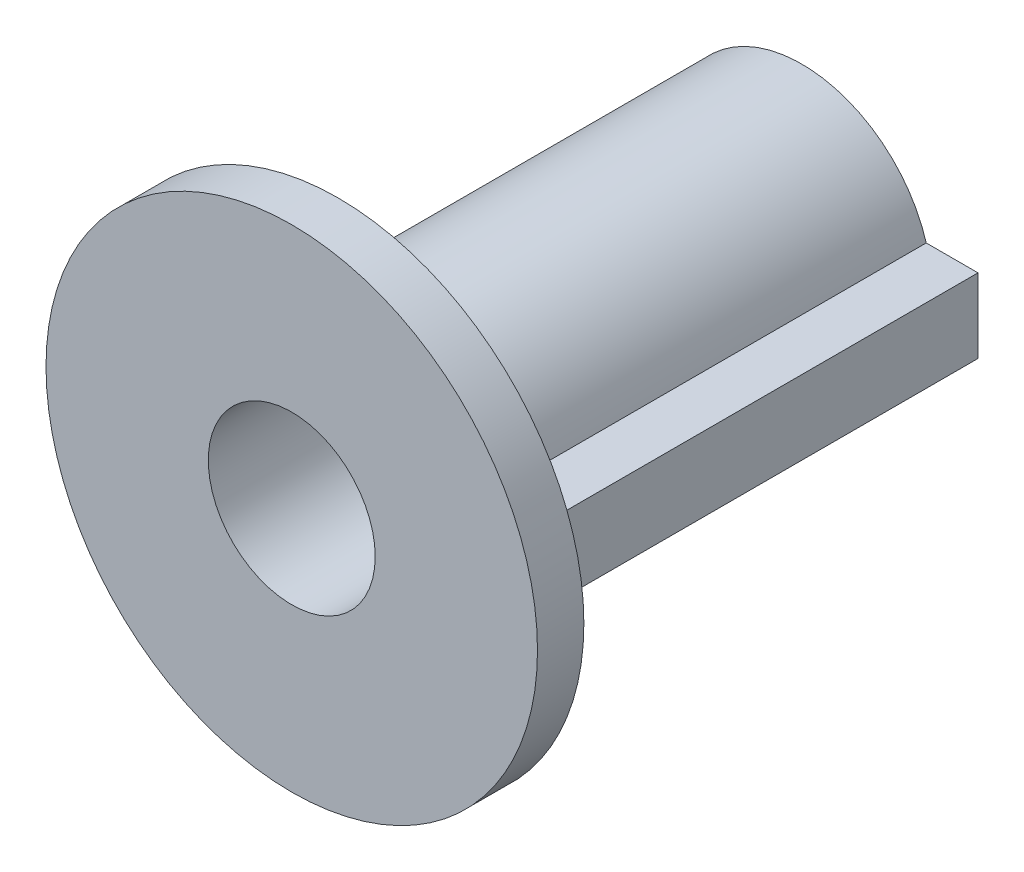
ISO-10303-21;
HEADER;
FILE_DESCRIPTION(('STEP AP214'),'2;1');
FILE_NAME('part.step','',(''),(''),'','','');
FILE_SCHEMA(('AUTOMOTIVE_DESIGN { 1 0 10303 214 1 1 1 1 }'));
ENDSEC;
DATA;
#1=APPLICATION_CONTEXT('core data for automotive mechanical design processes');
#2=APPLICATION_PROTOCOL_DEFINITION('international standard','automotive_design',2000,#1);
#3=PRODUCT_CONTEXT('',#1,'mechanical');
#4=PRODUCT('Part','Part','',(#3));
#5=PRODUCT_RELATED_PRODUCT_CATEGORY('part','',(#4));
#6=PRODUCT_DEFINITION_FORMATION('','',#4);
#7=PRODUCT_DEFINITION_CONTEXT('part definition',#1,'design');
#8=PRODUCT_DEFINITION('design','',#6,#7);
#9=PRODUCT_DEFINITION_SHAPE('','',#8);
#10=(LENGTH_UNIT() NAMED_UNIT(*) SI_UNIT(.MILLI.,.METRE.));
#11=(NAMED_UNIT(*) PLANE_ANGLE_UNIT() SI_UNIT($,.RADIAN.));
#12=(NAMED_UNIT(*) SI_UNIT($,.STERADIAN.) SOLID_ANGLE_UNIT());
#13=UNCERTAINTY_MEASURE_WITH_UNIT(LENGTH_MEASURE(1.E-05),#10,'distance_accuracy_value','');
#14=(GEOMETRIC_REPRESENTATION_CONTEXT(3) GLOBAL_UNCERTAINTY_ASSIGNED_CONTEXT((#13)) GLOBAL_UNIT_ASSIGNED_CONTEXT((#10,
#11,#12)) REPRESENTATION_CONTEXT('',''));
#15=CARTESIAN_POINT('',(0.,0.,0.));
#16=DIRECTION('',(0.,0.,1.));
#17=DIRECTION('',(1.,0.,0.));
#18=AXIS2_PLACEMENT_3D('',#15,#16,#17);
#19=CARTESIAN_POINT('',(-29.2,0.,13.655634003353));
#20=DIRECTION('',(-1.,0.,0.));
#21=DIRECTION('',(0.,0.,1.));
#22=AXIS2_PLACEMENT_3D('',#19,#20,#21);
#23=PLANE('',#22);
#24=DIRECTION('',(0.,0.,-1.));
#25=VECTOR('',#24,1.);
#26=CARTESIAN_POINT('',(-29.2,10.8,13.655634003353));
#27=LINE('',#26,#25);
#28=CARTESIAN_POINT('',(-29.2,10.8,5.));
#29=VERTEX_POINT('',#28);
#30=CARTESIAN_POINT('',(-29.2,10.8,-5.));
#31=VERTEX_POINT('',#30);
#32=EDGE_CURVE('E97',#29,#31,#27,.T.);
#33=ORIENTED_EDGE('',*,*,#32,.F.);
#34=DIRECTION('',(0.,-1.,0.));
#35=VECTOR('',#34,1.);
#36=CARTESIAN_POINT('',(-29.2,0.,5.));
#37=LINE('',#36,#35);
#38=CARTESIAN_POINT('',(-29.2,9.20000000000001,5.));
#39=VERTEX_POINT('',#38);
#40=EDGE_CURVE('E45',#29,#39,#37,.T.);
#41=ORIENTED_EDGE('',*,*,#40,.T.);
#42=DIRECTION('',(0.,0.,-1.));
#43=VECTOR('',#42,1.);
#44=CARTESIAN_POINT('',(-29.2,9.20000000000001,13.655634003353));
#45=LINE('',#44,#43);
#46=CARTESIAN_POINT('',(-29.2,9.20000000000001,-5.));
#47=VERTEX_POINT('',#46);
#48=EDGE_CURVE('E99',#39,#47,#45,.T.);
#49=ORIENTED_EDGE('',*,*,#48,.T.);
#50=DIRECTION('',(0.,-1.,0.));
#51=VECTOR('',#50,1.);
#52=CARTESIAN_POINT('',(-29.2,0.,-5.));
#53=LINE('',#52,#51);
#54=EDGE_CURVE('E112',#31,#47,#53,.T.);
#55=ORIENTED_EDGE('',*,*,#54,.F.);
#56=EDGE_LOOP('',(#33,#41,#49,#55));
#57=FACE_BOUND('',#56,.T.);
#58=ADVANCED_FACE('F41',(#57),#23,.F.);
#59=CARTESIAN_POINT('',(0.,9.20000000000001,13.655634003353));
#60=DIRECTION('',(0.,1.,0.));
#61=DIRECTION('',(0.,0.,1.));
#62=AXIS2_PLACEMENT_3D('',#59,#60,#61);
#63=PLANE('',#62);
#64=ORIENTED_EDGE('',*,*,#48,.F.);
#65=DIRECTION('',(-1.,0.,0.));
#66=VECTOR('',#65,1.);
#67=CARTESIAN_POINT('',(0.,9.20000000000001,5.));
#68=LINE('',#67,#66);
#69=CARTESIAN_POINT('',(-30.3167184270003,9.20000000000001,5.));
#70=VERTEX_POINT('',#69);
#71=EDGE_CURVE('E92',#39,#70,#68,.T.);
#72=ORIENTED_EDGE('',*,*,#71,.T.);
#73=DIRECTION('',(0.,0.,-1.));
#74=VECTOR('',#73,1.);
#75=CARTESIAN_POINT('',(-30.3167184270003,9.20000000000001,13.655634003353));
#76=LINE('',#75,#74);
#77=CARTESIAN_POINT('',(-30.3167184270003,9.20000000000001,-5.));
#78=VERTEX_POINT('',#77);
#79=EDGE_CURVE('E89',#70,#78,#76,.T.);
#80=ORIENTED_EDGE('',*,*,#79,.T.);
#81=DIRECTION('',(-1.,0.,0.));
#82=VECTOR('',#81,1.);
#83=CARTESIAN_POINT('',(0.,9.20000000000001,-5.));
#84=LINE('',#83,#82);
#85=EDGE_CURVE('E107',#47,#78,#84,.T.);
#86=ORIENTED_EDGE('',*,*,#85,.F.);
#87=EDGE_LOOP('',(#64,#72,#80,#86));
#88=FACE_BOUND('',#87,.T.);
#89=ADVANCED_FACE('F106',(#88),#63,.F.);
#90=CARTESIAN_POINT('',(-33.,10.,13.655634003353));
#91=DIRECTION('',(0.,0.,-1.));
#92=DIRECTION('',(-1.,0.,0.));
#93=AXIS2_PLACEMENT_3D('',#90,#91,#92);
#94=CYLINDRICAL_SURFACE('',#93,2.8);
#95=ORIENTED_EDGE('',*,*,#79,.F.);
#96=CARTESIAN_POINT('',(-33.,10.,5.));
#97=DIRECTION('',(0.,0.,-1.));
#98=DIRECTION('',(-1.,0.,0.));
#99=AXIS2_PLACEMENT_3D('',#96,#97,#98);
#100=CIRCLE('',#99,2.8);
#101=CARTESIAN_POINT('',(-30.3167184270003,10.8,5.));
#102=VERTEX_POINT('',#101);
#103=EDGE_CURVE('E50',#70,#102,#100,.T.);
#104=ORIENTED_EDGE('',*,*,#103,.T.);
#105=DIRECTION('',(0.,0.,-1.));
#106=VECTOR('',#105,1.);
#107=CARTESIAN_POINT('',(-30.3167184270003,10.8,13.655634003353));
#108=LINE('',#107,#106);
#109=CARTESIAN_POINT('',(-30.3167184270003,10.8,-5.));
#110=VERTEX_POINT('',#109);
#111=EDGE_CURVE('E65',#102,#110,#108,.T.);
#112=ORIENTED_EDGE('',*,*,#111,.T.);
#113=CARTESIAN_POINT('',(-33.,10.,-5.));
#114=DIRECTION('',(0.,0.,1.));
#115=DIRECTION('',(1.,0.,0.));
#116=AXIS2_PLACEMENT_3D('',#113,#114,#115);
#117=CIRCLE('',#116,2.8);
#118=EDGE_CURVE('E100',#78,#110,#117,.F.);
#119=ORIENTED_EDGE('',*,*,#118,.F.);
#120=EDGE_LOOP('',(#95,#104,#112,#119));
#121=FACE_BOUND('',#120,.T.);
#122=ADVANCED_FACE('F90',(#121),#94,.T.);
#123=CARTESIAN_POINT('',(0.,10.8,13.655634003353));
#124=DIRECTION('',(0.,-1.,0.));
#125=DIRECTION('',(0.,0.,-1.));
#126=AXIS2_PLACEMENT_3D('',#123,#124,#125);
#127=PLANE('',#126);
#128=ORIENTED_EDGE('',*,*,#111,.F.);
#129=DIRECTION('',(1.,0.,0.));
#130=VECTOR('',#129,1.);
#131=CARTESIAN_POINT('',(0.,10.8,5.));
#132=LINE('',#131,#130);
#133=EDGE_CURVE('E11',#102,#29,#132,.T.);
#134=ORIENTED_EDGE('',*,*,#133,.T.);
#135=ORIENTED_EDGE('',*,*,#32,.T.);
#136=DIRECTION('',(1.,0.,0.));
#137=VECTOR('',#136,1.);
#138=CARTESIAN_POINT('',(0.,10.8,-5.));
#139=LINE('',#138,#137);
#140=EDGE_CURVE('E88',#110,#31,#139,.T.);
#141=ORIENTED_EDGE('',*,*,#140,.F.);
#142=EDGE_LOOP('',(#128,#134,#135,#141));
#143=FACE_BOUND('',#142,.T.);
#144=ADVANCED_FACE('F43',(#143),#127,.F.);
#145=CARTESIAN_POINT('',(-33.,10.,-5.));
#146=DIRECTION('',(0.,0.,1.));
#147=DIRECTION('',(0.,-1.,0.));
#148=AXIS2_PLACEMENT_3D('',#145,#146,#147);
#149=PLANE('',#148);
#150=CARTESIAN_POINT('',(-33.,10.,-5.00000000000001));
#151=DIRECTION('',(0.,0.,1.));
#152=DIRECTION('',(1.,0.,0.));
#153=AXIS2_PLACEMENT_3D('',#150,#151,#152);
#154=CIRCLE('',#153,1.8);
#155=CARTESIAN_POINT('',(-31.2,10.,-5.00000000000001));
#156=VERTEX_POINT('',#155);
#157=EDGE_CURVE('E124',#156,#156,#154,.T.);
#158=ORIENTED_EDGE('',*,*,#157,.T.);
#159=EDGE_LOOP('',(#158));
#160=FACE_BOUND('',#159,.T.);
#161=ORIENTED_EDGE('',*,*,#140,.T.);
#162=ORIENTED_EDGE('',*,*,#54,.T.);
#163=ORIENTED_EDGE('',*,*,#85,.T.);
#164=ORIENTED_EDGE('',*,*,#118,.T.);
#165=EDGE_LOOP('',(#161,#162,#163,#164));
#166=FACE_BOUND('',#165,.T.);
#167=ADVANCED_FACE('F110',(#160,#166),#149,.F.);
#168=CARTESIAN_POINT('',(-33.,10.,6.));
#169=DIRECTION('',(0.,0.,1.));
#170=DIRECTION('',(1.,0.,0.));
#171=AXIS2_PLACEMENT_3D('',#168,#169,#170);
#172=PLANE('',#171);
#173=CARTESIAN_POINT('',(-33.,10.,6.00000000000001));
#174=DIRECTION('',(0.,0.,1.));
#175=DIRECTION('',(1.,0.,0.));
#176=AXIS2_PLACEMENT_3D('',#173,#174,#175);
#177=CIRCLE('',#176,1.79999999999999);
#178=CARTESIAN_POINT('',(-31.2,10.,6.00000000000001));
#179=VERTEX_POINT('',#178);
#180=EDGE_CURVE('E128',#179,#179,#177,.T.);
#181=ORIENTED_EDGE('',*,*,#180,.F.);
#182=EDGE_LOOP('',(#181));
#183=FACE_BOUND('',#182,.T.);
#184=CARTESIAN_POINT('',(-33.,10.,6.));
#185=DIRECTION('',(0.,0.,1.));
#186=DIRECTION('',(1.,0.,0.));
#187=AXIS2_PLACEMENT_3D('',#184,#185,#186);
#188=CIRCLE('',#187,5.3);
#189=CARTESIAN_POINT('',(-27.7,10.,6.));
#190=VERTEX_POINT('',#189);
#191=EDGE_CURVE('E119',#190,#190,#188,.T.);
#192=ORIENTED_EDGE('',*,*,#191,.T.);
#193=EDGE_LOOP('',(#192));
#194=FACE_BOUND('',#193,.T.);
#195=ADVANCED_FACE('F134',(#183,#194),#172,.T.);
#196=CARTESIAN_POINT('',(-33.,10.,5.));
#197=DIRECTION('',(0.,0.,1.));
#198=DIRECTION('',(1.,0.,0.));
#199=AXIS2_PLACEMENT_3D('',#196,#197,#198);
#200=PLANE('',#199);
#201=ORIENTED_EDGE('',*,*,#103,.F.);
#202=ORIENTED_EDGE('',*,*,#71,.F.);
#203=ORIENTED_EDGE('',*,*,#40,.F.);
#204=ORIENTED_EDGE('',*,*,#133,.F.);
#205=EDGE_LOOP('',(#201,#202,#203,#204));
#206=FACE_BOUND('',#205,.T.);
#207=CARTESIAN_POINT('',(-33.,10.,5.));
#208=DIRECTION('',(0.,0.,1.));
#209=DIRECTION('',(1.,0.,0.));
#210=AXIS2_PLACEMENT_3D('',#207,#208,#209);
#211=CIRCLE('',#210,5.3);
#212=CARTESIAN_POINT('',(-27.7,10.,5.));
#213=VERTEX_POINT('',#212);
#214=EDGE_CURVE('E116',#213,#213,#211,.T.);
#215=ORIENTED_EDGE('',*,*,#214,.F.);
#216=EDGE_LOOP('',(#215));
#217=FACE_BOUND('',#216,.T.);
#218=ADVANCED_FACE('F81',(#206,#217),#200,.F.);
#219=CARTESIAN_POINT('',(-33.,10.,6.));
#220=DIRECTION('',(0.,0.,-1.));
#221=DIRECTION('',(-1.,0.,0.));
#222=AXIS2_PLACEMENT_3D('',#219,#220,#221);
#223=CYLINDRICAL_SURFACE('',#222,5.3);
#224=ORIENTED_EDGE('',*,*,#191,.F.);
#225=EDGE_LOOP('',(#224));
#226=FACE_BOUND('',#225,.T.);
#227=ORIENTED_EDGE('',*,*,#214,.T.);
#228=EDGE_LOOP('',(#227));
#229=FACE_BOUND('',#228,.T.);
#230=ADVANCED_FACE('F142',(#226,#229),#223,.T.);
#231=CARTESIAN_POINT('',(-33.,10.,6.));
#232=DIRECTION('',(0.,0.,1.));
#233=DIRECTION('',(1.,0.,0.));
#234=AXIS2_PLACEMENT_3D('',#231,#232,#233);
#235=CYLINDRICAL_SURFACE('',#234,1.79999999999999);
#236=ORIENTED_EDGE('',*,*,#157,.F.);
#237=EDGE_LOOP('',(#236));
#238=FACE_BOUND('',#237,.T.);
#239=ORIENTED_EDGE('',*,*,#180,.T.);
#240=EDGE_LOOP('',(#239));
#241=FACE_BOUND('',#240,.T.);
#242=ADVANCED_FACE('F132',(#238,#241),#235,.F.);
#243=CLOSED_SHELL('',(#58,#89,#122,#144,#167,#195,#218,#230,#242));
#244=MANIFOLD_SOLID_BREP('B2',#243);
#245=ADVANCED_BREP_SHAPE_REPRESENTATION('',(#18,#244),#14);
#246=SHAPE_DEFINITION_REPRESENTATION(#9,#245);
ENDSEC;
END-ISO-10303-21;
